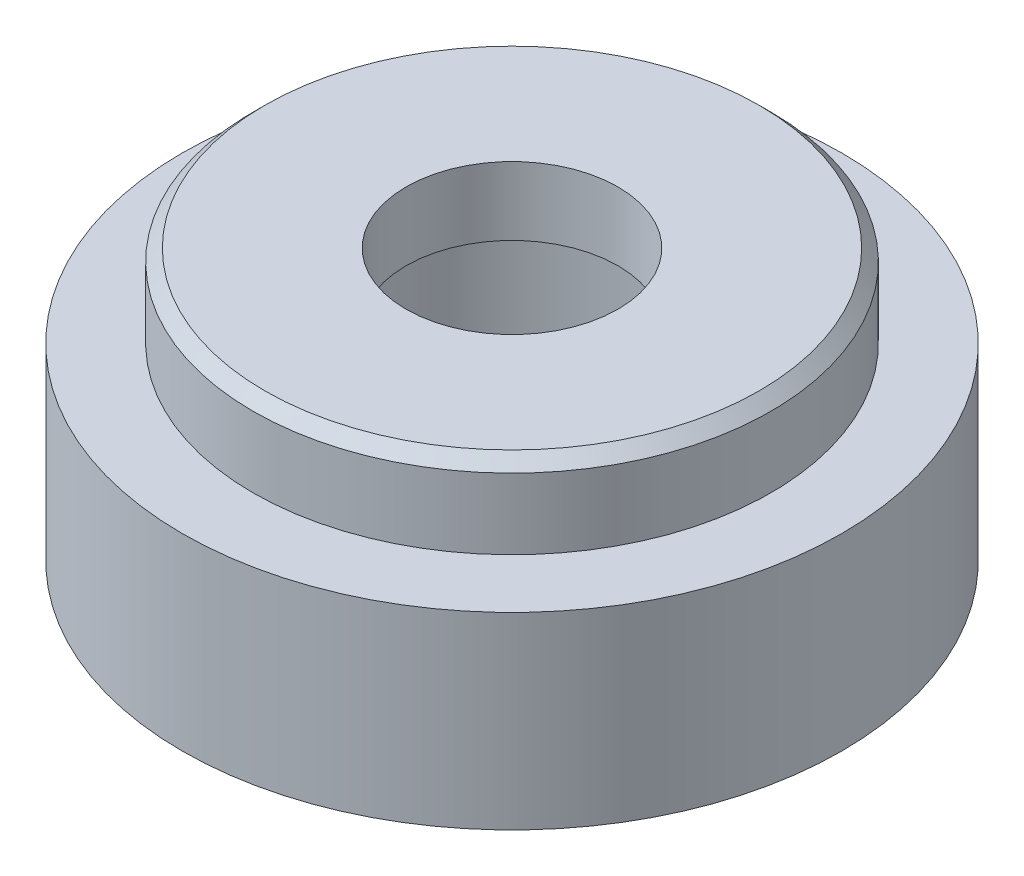
ISO-10303-21;
HEADER;
FILE_DESCRIPTION(('STEP AP214'),'2;1');
FILE_NAME('part.step','',(''),(''),'','','');
FILE_SCHEMA(('AUTOMOTIVE_DESIGN { 1 0 10303 214 1 1 1 1 }'));
ENDSEC;
DATA;
#1=APPLICATION_CONTEXT('core data for automotive mechanical design processes');
#2=APPLICATION_PROTOCOL_DEFINITION('international standard','automotive_design',2000,#1);
#3=PRODUCT_CONTEXT('',#1,'mechanical');
#4=PRODUCT('Part','Part','',(#3));
#5=PRODUCT_RELATED_PRODUCT_CATEGORY('part','',(#4));
#6=PRODUCT_DEFINITION_FORMATION('','',#4);
#7=PRODUCT_DEFINITION_CONTEXT('part definition',#1,'design');
#8=PRODUCT_DEFINITION('design','',#6,#7);
#9=PRODUCT_DEFINITION_SHAPE('','',#8);
#10=(LENGTH_UNIT() NAMED_UNIT(*) SI_UNIT(.MILLI.,.METRE.));
#11=(NAMED_UNIT(*) PLANE_ANGLE_UNIT() SI_UNIT($,.RADIAN.));
#12=(NAMED_UNIT(*) SI_UNIT($,.STERADIAN.) SOLID_ANGLE_UNIT());
#13=UNCERTAINTY_MEASURE_WITH_UNIT(LENGTH_MEASURE(1.E-05),#10,'distance_accuracy_value','');
#14=(GEOMETRIC_REPRESENTATION_CONTEXT(3) GLOBAL_UNCERTAINTY_ASSIGNED_CONTEXT((#13)) GLOBAL_UNIT_ASSIGNED_CONTEXT((#10,
#11,#12)) REPRESENTATION_CONTEXT('',''));
#15=CARTESIAN_POINT('',(0.,0.,0.));
#16=DIRECTION('',(0.,0.,1.));
#17=DIRECTION('',(1.,0.,0.));
#18=AXIS2_PLACEMENT_3D('',#15,#16,#17);
#19=CARTESIAN_POINT('',(0.,8.,0.));
#20=DIRECTION('',(0.,-1.,0.));
#21=DIRECTION('',(0.,0.,-1.));
#22=AXIS2_PLACEMENT_3D('',#19,#20,#21);
#23=CYLINDRICAL_SURFACE('',#22,14.);
#24=CARTESIAN_POINT('',(0.,8.,0.));
#25=DIRECTION('',(0.,1.,0.));
#26=DIRECTION('',(0.,0.,1.));
#27=AXIS2_PLACEMENT_3D('',#24,#25,#26);
#28=CIRCLE('',#27,14.);
#29=CARTESIAN_POINT('',(0.,8.,14.));
#30=VERTEX_POINT('',#29);
#31=EDGE_CURVE('E45',#30,#30,#28,.T.);
#32=ORIENTED_EDGE('',*,*,#31,.F.);
#33=EDGE_LOOP('',(#32));
#34=FACE_BOUND('',#33,.T.);
#35=CARTESIAN_POINT('',(0.,0.,0.));
#36=DIRECTION('',(0.,1.,0.));
#37=DIRECTION('',(0.,0.,1.));
#38=AXIS2_PLACEMENT_3D('',#35,#36,#37);
#39=CIRCLE('',#38,14.);
#40=CARTESIAN_POINT('',(0.,0.,14.));
#41=VERTEX_POINT('',#40);
#42=EDGE_CURVE('E49',#41,#41,#39,.T.);
#43=ORIENTED_EDGE('',*,*,#42,.T.);
#44=EDGE_LOOP('',(#43));
#45=FACE_BOUND('',#44,.T.);
#46=ADVANCED_FACE('F34',(#34,#45),#23,.T.);
#47=CARTESIAN_POINT('',(0.,8.,0.));
#48=DIRECTION('',(0.,1.,0.));
#49=DIRECTION('',(0.,0.,1.));
#50=AXIS2_PLACEMENT_3D('',#47,#48,#49);
#51=PLANE('',#50);
#52=CARTESIAN_POINT('',(0.,8.,0.));
#53=DIRECTION('',(0.,1.,0.));
#54=DIRECTION('',(0.,0.,1.));
#55=AXIS2_PLACEMENT_3D('',#52,#53,#54);
#56=CIRCLE('',#55,11.);
#57=CARTESIAN_POINT('',(0.,8.,11.));
#58=VERTEX_POINT('',#57);
#59=EDGE_CURVE('E53',#58,#58,#56,.T.);
#60=ORIENTED_EDGE('',*,*,#59,.F.);
#61=EDGE_LOOP('',(#60));
#62=FACE_BOUND('',#61,.T.);
#63=ORIENTED_EDGE('',*,*,#31,.T.);
#64=EDGE_LOOP('',(#63));
#65=FACE_BOUND('',#64,.T.);
#66=ADVANCED_FACE('F76',(#62,#65),#51,.T.);
#67=CARTESIAN_POINT('',(0.,0.,0.));
#68=DIRECTION('',(0.,1.,0.));
#69=DIRECTION('',(0.,0.,1.));
#70=AXIS2_PLACEMENT_3D('',#67,#68,#69);
#71=PLANE('',#70);
#72=CARTESIAN_POINT('',(0.,0.,0.));
#73=DIRECTION('',(0.,-1.,0.));
#74=DIRECTION('',(0.,0.,-1.));
#75=AXIS2_PLACEMENT_3D('',#72,#73,#74);
#76=CIRCLE('',#75,7.5);
#77=CARTESIAN_POINT('',(0.,0.,-7.5));
#78=VERTEX_POINT('',#77);
#79=EDGE_CURVE('E66',#78,#78,#76,.T.);
#80=ORIENTED_EDGE('',*,*,#79,.F.);
#81=EDGE_LOOP('',(#80));
#82=FACE_BOUND('',#81,.T.);
#83=ORIENTED_EDGE('',*,*,#42,.F.);
#84=EDGE_LOOP('',(#83));
#85=FACE_BOUND('',#84,.T.);
#86=ADVANCED_FACE('F72',(#82,#85),#71,.F.);
#87=CARTESIAN_POINT('',(0.,11.5,0.));
#88=DIRECTION('',(0.,-1.,0.));
#89=DIRECTION('',(0.,0.,-1.));
#90=AXIS2_PLACEMENT_3D('',#87,#88,#89);
#91=CYLINDRICAL_SURFACE('',#90,11.);
#92=CARTESIAN_POINT('',(0.,11.,0.));
#93=DIRECTION('',(0.,1.,0.));
#94=DIRECTION('',(0.,0.,1.));
#95=AXIS2_PLACEMENT_3D('',#92,#93,#94);
#96=CIRCLE('',#95,11.);
#97=CARTESIAN_POINT('',(0.,11.,11.));
#98=VERTEX_POINT('',#97);
#99=EDGE_CURVE('E10',#98,#98,#96,.F.);
#100=ORIENTED_EDGE('',*,*,#99,.T.);
#101=EDGE_LOOP('',(#100));
#102=FACE_BOUND('',#101,.T.);
#103=ORIENTED_EDGE('',*,*,#59,.T.);
#104=EDGE_LOOP('',(#103));
#105=FACE_BOUND('',#104,.T.);
#106=ADVANCED_FACE('F75',(#102,#105),#91,.T.);
#107=CARTESIAN_POINT('',(0.,11.5,0.));
#108=DIRECTION('',(0.,1.,0.));
#109=DIRECTION('',(0.,0.,1.));
#110=AXIS2_PLACEMENT_3D('',#107,#108,#109);
#111=PLANE('',#110);
#112=CARTESIAN_POINT('',(0.,11.5,0.));
#113=DIRECTION('',(0.,1.,0.));
#114=DIRECTION('',(0.,0.,1.));
#115=AXIS2_PLACEMENT_3D('',#112,#113,#114);
#116=CIRCLE('',#115,10.5);
#117=CARTESIAN_POINT('',(0.,11.5,10.5));
#118=VERTEX_POINT('',#117);
#119=EDGE_CURVE('E41',#118,#118,#116,.T.);
#120=ORIENTED_EDGE('',*,*,#119,.T.);
#121=EDGE_LOOP('',(#120));
#122=FACE_BOUND('',#121,.T.);
#123=CARTESIAN_POINT('',(0.,11.5,0.));
#124=DIRECTION('',(0.,-1.,0.));
#125=DIRECTION('',(0.,0.,-1.));
#126=AXIS2_PLACEMENT_3D('',#123,#124,#125);
#127=CIRCLE('',#126,4.5);
#128=CARTESIAN_POINT('',(0.,11.5,-4.5));
#129=VERTEX_POINT('',#128);
#130=EDGE_CURVE('E57',#129,#129,#127,.T.);
#131=ORIENTED_EDGE('',*,*,#130,.T.);
#132=EDGE_LOOP('',(#131));
#133=FACE_BOUND('',#132,.T.);
#134=ADVANCED_FACE('F91',(#122,#133),#111,.T.);
#135=CARTESIAN_POINT('',(0.,0.,0.));
#136=DIRECTION('',(0.,-1.,0.));
#137=DIRECTION('',(0.,0.,-1.));
#138=AXIS2_PLACEMENT_3D('',#135,#136,#137);
#139=CYLINDRICAL_SURFACE('',#138,4.50000000000001);
#140=ORIENTED_EDGE('',*,*,#130,.F.);
#141=EDGE_LOOP('',(#140));
#142=FACE_BOUND('',#141,.T.);
#143=CARTESIAN_POINT('',(0.,8.6,0.));
#144=DIRECTION('',(0.,-1.,0.));
#145=DIRECTION('',(0.,0.,-1.));
#146=AXIS2_PLACEMENT_3D('',#143,#144,#145);
#147=CIRCLE('',#146,4.50000000000002);
#148=CARTESIAN_POINT('',(0.,8.6,-4.50000000000002));
#149=VERTEX_POINT('',#148);
#150=EDGE_CURVE('E60',#149,#149,#147,.T.);
#151=ORIENTED_EDGE('',*,*,#150,.T.);
#152=EDGE_LOOP('',(#151));
#153=FACE_BOUND('',#152,.T.);
#154=ADVANCED_FACE('F94',(#142,#153),#139,.F.);
#155=CARTESIAN_POINT('',(4.50000000000002,8.6,0.));
#156=DIRECTION('',(0.,1.,0.));
#157=DIRECTION('',(0.,0.,1.));
#158=AXIS2_PLACEMENT_3D('',#155,#156,#157);
#159=PLANE('',#158);
#160=ORIENTED_EDGE('',*,*,#150,.F.);
#161=EDGE_LOOP('',(#160));
#162=FACE_BOUND('',#161,.T.);
#163=CARTESIAN_POINT('',(0.,8.6,0.));
#164=DIRECTION('',(0.,-1.,0.));
#165=DIRECTION('',(0.,0.,-1.));
#166=AXIS2_PLACEMENT_3D('',#163,#164,#165);
#167=CIRCLE('',#166,7.5);
#168=CARTESIAN_POINT('',(0.,8.6,-7.5));
#169=VERTEX_POINT('',#168);
#170=EDGE_CURVE('E63',#169,#169,#167,.T.);
#171=ORIENTED_EDGE('',*,*,#170,.T.);
#172=EDGE_LOOP('',(#171));
#173=FACE_BOUND('',#172,.T.);
#174=ADVANCED_FACE('F97',(#162,#173),#159,.F.);
#175=CARTESIAN_POINT('',(0.,0.,0.));
#176=DIRECTION('',(0.,-1.,0.));
#177=DIRECTION('',(0.,0.,-1.));
#178=AXIS2_PLACEMENT_3D('',#175,#176,#177);
#179=CYLINDRICAL_SURFACE('',#178,7.5);
#180=ORIENTED_EDGE('',*,*,#170,.F.);
#181=EDGE_LOOP('',(#180));
#182=FACE_BOUND('',#181,.T.);
#183=ORIENTED_EDGE('',*,*,#79,.T.);
#184=EDGE_LOOP('',(#183));
#185=FACE_BOUND('',#184,.T.);
#186=ADVANCED_FACE('F70',(#182,#185),#179,.F.);
#187=CARTESIAN_POINT('',(0.,11.5,0.));
#188=DIRECTION('',(0.,-1.,0.));
#189=DIRECTION('',(0.,0.,-1.));
#190=AXIS2_PLACEMENT_3D('',#187,#188,#189);
#191=CONICAL_SURFACE('',#190,10.5,0.785398163397445);
#192=ORIENTED_EDGE('',*,*,#99,.F.);
#193=EDGE_LOOP('',(#192));
#194=FACE_BOUND('',#193,.T.);
#195=ORIENTED_EDGE('',*,*,#119,.F.);
#196=EDGE_LOOP('',(#195));
#197=FACE_BOUND('',#196,.T.);
#198=ADVANCED_FACE('F36',(#194,#197),#191,.T.);
#199=CLOSED_SHELL('',(#46,#66,#86,#106,#134,#154,#174,#186,#198));
#200=MANIFOLD_SOLID_BREP('B2',#199);
#201=ADVANCED_BREP_SHAPE_REPRESENTATION('',(#18,#200),#14);
#202=SHAPE_DEFINITION_REPRESENTATION(#9,#201);
ENDSEC;
END-ISO-10303-21;
